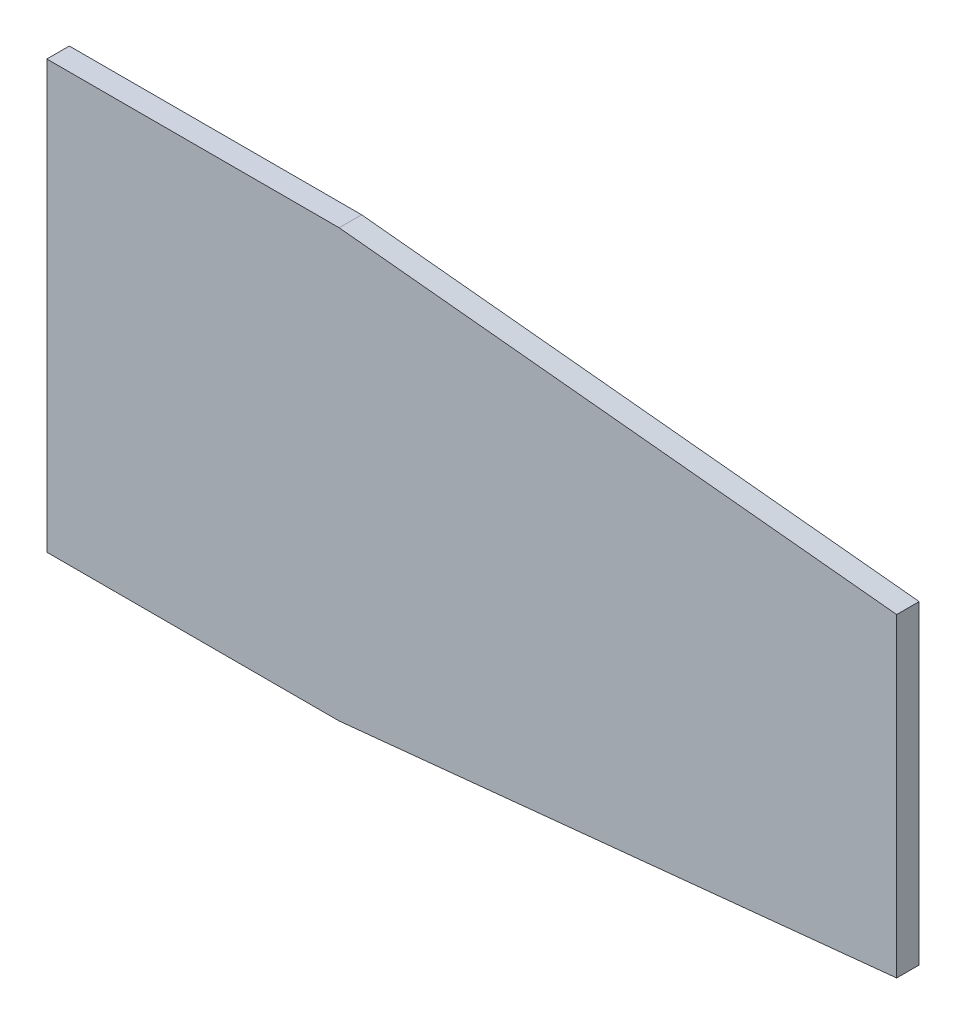
ISO-10303-21;
HEADER;
FILE_DESCRIPTION(('STEP AP214'),'2;1');
FILE_NAME('part.step','',(''),(''),'','','');
FILE_SCHEMA(('AUTOMOTIVE_DESIGN { 1 0 10303 214 1 1 1 1 }'));
ENDSEC;
DATA;
#1=APPLICATION_CONTEXT('core data for automotive mechanical design processes');
#2=APPLICATION_PROTOCOL_DEFINITION('international standard','automotive_design',2000,#1);
#3=PRODUCT_CONTEXT('',#1,'mechanical');
#4=PRODUCT('Part','Part','',(#3));
#5=PRODUCT_RELATED_PRODUCT_CATEGORY('part','',(#4));
#6=PRODUCT_DEFINITION_FORMATION('','',#4);
#7=PRODUCT_DEFINITION_CONTEXT('part definition',#1,'design');
#8=PRODUCT_DEFINITION('design','',#6,#7);
#9=PRODUCT_DEFINITION_SHAPE('','',#8);
#10=(LENGTH_UNIT() NAMED_UNIT(*) SI_UNIT(.MILLI.,.METRE.));
#11=(NAMED_UNIT(*) PLANE_ANGLE_UNIT() SI_UNIT($,.RADIAN.));
#12=(NAMED_UNIT(*) SI_UNIT($,.STERADIAN.) SOLID_ANGLE_UNIT());
#13=UNCERTAINTY_MEASURE_WITH_UNIT(LENGTH_MEASURE(1.E-05),#10,'distance_accuracy_value','');
#14=(GEOMETRIC_REPRESENTATION_CONTEXT(3) GLOBAL_UNCERTAINTY_ASSIGNED_CONTEXT((#13)) GLOBAL_UNIT_ASSIGNED_CONTEXT((#10,
#11,#12)) REPRESENTATION_CONTEXT('',''));
#15=CARTESIAN_POINT('',(0.,0.,0.));
#16=DIRECTION('',(0.,0.,1.));
#17=DIRECTION('',(1.,0.,0.));
#18=AXIS2_PLACEMENT_3D('',#15,#16,#17);
#19=CARTESIAN_POINT('',(65.,-47.5,5.));
#20=DIRECTION('',(-0.100298127924028,0.994957429006355,0.));
#21=DIRECTION('',(-0.994957429006355,-0.100298127924028,0.));
#22=AXIS2_PLACEMENT_3D('',#19,#20,#21);
#23=PLANE('',#22);
#24=DIRECTION('',(0.994957429006355,0.100298127924028,0.));
#25=VECTOR('',#24,1.);
#26=CARTESIAN_POINT('',(65.,-47.5,0.));
#27=LINE('',#26,#25);
#28=CARTESIAN_POINT('',(65.,-47.5,0.));
#29=VERTEX_POINT('',#28);
#30=CARTESIAN_POINT('',(189.,-35.,0.));
#31=VERTEX_POINT('',#30);
#32=EDGE_CURVE('E117',#29,#31,#27,.T.);
#33=ORIENTED_EDGE('',*,*,#32,.T.);
#34=DIRECTION('',(0.,0.,-1.));
#35=VECTOR('',#34,1.);
#36=CARTESIAN_POINT('',(189.,-35.,5.));
#37=LINE('',#36,#35);
#38=CARTESIAN_POINT('',(189.,-35.,5.));
#39=VERTEX_POINT('',#38);
#40=EDGE_CURVE('E11',#39,#31,#37,.T.);
#41=ORIENTED_EDGE('',*,*,#40,.F.);
#42=DIRECTION('',(0.994957429006355,0.100298127924028,0.));
#43=VECTOR('',#42,1.);
#44=CARTESIAN_POINT('',(65.,-47.5,5.));
#45=LINE('',#44,#43);
#46=CARTESIAN_POINT('',(65.,-47.5,5.));
#47=VERTEX_POINT('',#46);
#48=EDGE_CURVE('E127',#47,#39,#45,.T.);
#49=ORIENTED_EDGE('',*,*,#48,.F.);
#50=DIRECTION('',(0.,0.,-1.));
#51=VECTOR('',#50,1.);
#52=CARTESIAN_POINT('',(65.,-47.5,5.));
#53=LINE('',#52,#51);
#54=EDGE_CURVE('E113',#47,#29,#53,.T.);
#55=ORIENTED_EDGE('',*,*,#54,.T.);
#56=EDGE_LOOP('',(#33,#41,#49,#55));
#57=FACE_BOUND('',#56,.T.);
#58=ADVANCED_FACE('F33',(#57),#23,.F.);
#59=CARTESIAN_POINT('',(189.,35.,5.));
#60=DIRECTION('',(-1.,0.,0.));
#61=DIRECTION('',(0.,0.,1.));
#62=AXIS2_PLACEMENT_3D('',#59,#60,#61);
#63=PLANE('',#62);
#64=DIRECTION('',(0.,1.,0.));
#65=VECTOR('',#64,1.);
#66=CARTESIAN_POINT('',(189.,35.,0.));
#67=LINE('',#66,#65);
#68=CARTESIAN_POINT('',(189.,35.,0.));
#69=VERTEX_POINT('',#68);
#70=EDGE_CURVE('E120',#31,#69,#67,.T.);
#71=ORIENTED_EDGE('',*,*,#70,.T.);
#72=DIRECTION('',(0.,0.,-1.));
#73=VECTOR('',#72,1.);
#74=CARTESIAN_POINT('',(189.,35.,5.));
#75=LINE('',#74,#73);
#76=CARTESIAN_POINT('',(189.,35.,5.));
#77=VERTEX_POINT('',#76);
#78=EDGE_CURVE('E41',#77,#69,#75,.T.);
#79=ORIENTED_EDGE('',*,*,#78,.F.);
#80=DIRECTION('',(0.,1.,0.));
#81=VECTOR('',#80,1.);
#82=CARTESIAN_POINT('',(189.,35.,5.));
#83=LINE('',#82,#81);
#84=EDGE_CURVE('E86',#39,#77,#83,.T.);
#85=ORIENTED_EDGE('',*,*,#84,.F.);
#86=ORIENTED_EDGE('',*,*,#40,.T.);
#87=EDGE_LOOP('',(#71,#79,#85,#86));
#88=FACE_BOUND('',#87,.T.);
#89=ADVANCED_FACE('F151',(#88),#63,.F.);
#90=CARTESIAN_POINT('',(65.,47.5,5.));
#91=DIRECTION('',(-0.100298127924028,-0.994957429006355,0.));
#92=DIRECTION('',(0.994957429006355,-0.100298127924028,0.));
#93=AXIS2_PLACEMENT_3D('',#90,#91,#92);
#94=PLANE('',#93);
#95=DIRECTION('',(-0.994957429006355,0.100298127924028,0.));
#96=VECTOR('',#95,1.);
#97=CARTESIAN_POINT('',(65.,47.5,0.));
#98=LINE('',#97,#96);
#99=CARTESIAN_POINT('',(65.,47.5,0.));
#100=VERTEX_POINT('',#99);
#101=EDGE_CURVE('E122',#69,#100,#98,.T.);
#102=ORIENTED_EDGE('',*,*,#101,.T.);
#103=DIRECTION('',(0.,0.,-1.));
#104=VECTOR('',#103,1.);
#105=CARTESIAN_POINT('',(65.,47.5,5.));
#106=LINE('',#105,#104);
#107=CARTESIAN_POINT('',(65.,47.5,5.));
#108=VERTEX_POINT('',#107);
#109=EDGE_CURVE('E108',#108,#100,#106,.T.);
#110=ORIENTED_EDGE('',*,*,#109,.F.);
#111=DIRECTION('',(-0.994957429006355,0.100298127924028,0.));
#112=VECTOR('',#111,1.);
#113=CARTESIAN_POINT('',(65.,47.5,5.));
#114=LINE('',#113,#112);
#115=EDGE_CURVE('E99',#77,#108,#114,.T.);
#116=ORIENTED_EDGE('',*,*,#115,.F.);
#117=ORIENTED_EDGE('',*,*,#78,.T.);
#118=EDGE_LOOP('',(#102,#110,#116,#117));
#119=FACE_BOUND('',#118,.T.);
#120=ADVANCED_FACE('F133',(#119),#94,.F.);
#121=CARTESIAN_POINT('',(0.,47.5,5.));
#122=DIRECTION('',(0.,-1.,0.));
#123=DIRECTION('',(0.,0.,-1.));
#124=AXIS2_PLACEMENT_3D('',#121,#122,#123);
#125=PLANE('',#124);
#126=DIRECTION('',(-1.,0.,0.));
#127=VECTOR('',#126,1.);
#128=CARTESIAN_POINT('',(0.,47.5,0.));
#129=LINE('',#128,#127);
#130=CARTESIAN_POINT('',(0.,47.5,0.));
#131=VERTEX_POINT('',#130);
#132=EDGE_CURVE('E107',#100,#131,#129,.T.);
#133=ORIENTED_EDGE('',*,*,#132,.T.);
#134=DIRECTION('',(0.,0.,-1.));
#135=VECTOR('',#134,1.);
#136=CARTESIAN_POINT('',(0.,47.5,5.));
#137=LINE('',#136,#135);
#138=CARTESIAN_POINT('',(0.,47.5,5.));
#139=VERTEX_POINT('',#138);
#140=EDGE_CURVE('E104',#139,#131,#137,.T.);
#141=ORIENTED_EDGE('',*,*,#140,.F.);
#142=DIRECTION('',(-1.,0.,0.));
#143=VECTOR('',#142,1.);
#144=CARTESIAN_POINT('',(0.,47.5,5.));
#145=LINE('',#144,#143);
#146=EDGE_CURVE('E93',#108,#139,#145,.T.);
#147=ORIENTED_EDGE('',*,*,#146,.F.);
#148=ORIENTED_EDGE('',*,*,#109,.T.);
#149=EDGE_LOOP('',(#133,#141,#147,#148));
#150=FACE_BOUND('',#149,.T.);
#151=ADVANCED_FACE('F105',(#150),#125,.F.);
#152=CARTESIAN_POINT('',(0.,-47.5,5.));
#153=DIRECTION('',(1.,0.,0.));
#154=DIRECTION('',(0.,0.,-1.));
#155=AXIS2_PLACEMENT_3D('',#152,#153,#154);
#156=PLANE('',#155);
#157=DIRECTION('',(0.,-1.,0.));
#158=VECTOR('',#157,1.);
#159=CARTESIAN_POINT('',(0.,-47.5,0.));
#160=LINE('',#159,#158);
#161=CARTESIAN_POINT('',(0.,-47.5,0.));
#162=VERTEX_POINT('',#161);
#163=EDGE_CURVE('E72',#131,#162,#160,.T.);
#164=ORIENTED_EDGE('',*,*,#163,.T.);
#165=DIRECTION('',(0.,0.,-1.));
#166=VECTOR('',#165,1.);
#167=CARTESIAN_POINT('',(0.,-47.5,5.));
#168=LINE('',#167,#166);
#169=CARTESIAN_POINT('',(0.,-47.5,5.));
#170=VERTEX_POINT('',#169);
#171=EDGE_CURVE('E109',#170,#162,#168,.T.);
#172=ORIENTED_EDGE('',*,*,#171,.F.);
#173=DIRECTION('',(0.,-1.,0.));
#174=VECTOR('',#173,1.);
#175=CARTESIAN_POINT('',(0.,-47.5,5.));
#176=LINE('',#175,#174);
#177=EDGE_CURVE('E97',#139,#170,#176,.T.);
#178=ORIENTED_EDGE('',*,*,#177,.F.);
#179=ORIENTED_EDGE('',*,*,#140,.T.);
#180=EDGE_LOOP('',(#164,#172,#178,#179));
#181=FACE_BOUND('',#180,.T.);
#182=ADVANCED_FACE('F111',(#181),#156,.F.);
#183=CARTESIAN_POINT('',(0.,-47.5,5.));
#184=DIRECTION('',(0.,1.,0.));
#185=DIRECTION('',(0.,0.,1.));
#186=AXIS2_PLACEMENT_3D('',#183,#184,#185);
#187=PLANE('',#186);
#188=DIRECTION('',(1.,0.,0.));
#189=VECTOR('',#188,1.);
#190=CARTESIAN_POINT('',(0.,-47.5,0.));
#191=LINE('',#190,#189);
#192=EDGE_CURVE('E78',#162,#29,#191,.T.);
#193=ORIENTED_EDGE('',*,*,#192,.T.);
#194=ORIENTED_EDGE('',*,*,#54,.F.);
#195=DIRECTION('',(1.,0.,0.));
#196=VECTOR('',#195,1.);
#197=CARTESIAN_POINT('',(0.,-47.5,5.));
#198=LINE('',#197,#196);
#199=EDGE_CURVE('E49',#170,#47,#198,.T.);
#200=ORIENTED_EDGE('',*,*,#199,.F.);
#201=ORIENTED_EDGE('',*,*,#171,.T.);
#202=EDGE_LOOP('',(#193,#194,#200,#201));
#203=FACE_BOUND('',#202,.T.);
#204=ADVANCED_FACE('F140',(#203),#187,.F.);
#205=CARTESIAN_POINT('',(0.,0.,5.));
#206=DIRECTION('',(0.,0.,-1.));
#207=DIRECTION('',(-1.,0.,0.));
#208=AXIS2_PLACEMENT_3D('',#205,#206,#207);
#209=PLANE('',#208);
#210=ORIENTED_EDGE('',*,*,#48,.T.);
#211=ORIENTED_EDGE('',*,*,#84,.T.);
#212=ORIENTED_EDGE('',*,*,#115,.T.);
#213=ORIENTED_EDGE('',*,*,#146,.T.);
#214=ORIENTED_EDGE('',*,*,#177,.T.);
#215=ORIENTED_EDGE('',*,*,#199,.T.);
#216=EDGE_LOOP('',(#210,#211,#212,#213,#214,#215));
#217=FACE_BOUND('',#216,.T.);
#218=ADVANCED_FACE('F95',(#217),#209,.F.);
#219=CARTESIAN_POINT('',(0.,0.,0.));
#220=DIRECTION('',(0.,0.,-1.));
#221=DIRECTION('',(-1.,0.,0.));
#222=AXIS2_PLACEMENT_3D('',#219,#220,#221);
#223=PLANE('',#222);
#224=ORIENTED_EDGE('',*,*,#32,.F.);
#225=ORIENTED_EDGE('',*,*,#192,.F.);
#226=ORIENTED_EDGE('',*,*,#163,.F.);
#227=ORIENTED_EDGE('',*,*,#132,.F.);
#228=ORIENTED_EDGE('',*,*,#101,.F.);
#229=ORIENTED_EDGE('',*,*,#70,.F.);
#230=EDGE_LOOP('',(#224,#225,#226,#227,#228,#229));
#231=FACE_BOUND('',#230,.T.);
#232=ADVANCED_FACE('F136',(#231),#223,.T.);
#233=CLOSED_SHELL('',(#58,#89,#120,#151,#182,#204,#218,#232));
#234=MANIFOLD_SOLID_BREP('B2',#233);
#235=ADVANCED_BREP_SHAPE_REPRESENTATION('',(#18,#234),#14);
#236=SHAPE_DEFINITION_REPRESENTATION(#9,#235);
ENDSEC;
END-ISO-10303-21;
